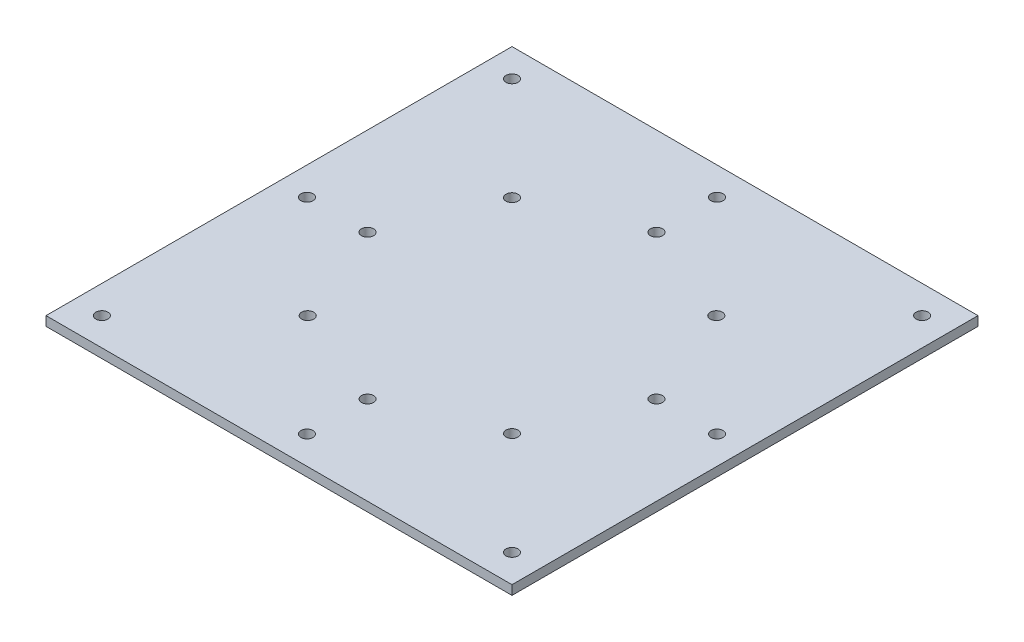
ISO-10303-21;
HEADER;
FILE_DESCRIPTION(('STEP AP214'),'2;1');
FILE_NAME('part.step','',(''),(''),'','','');
FILE_SCHEMA(('AUTOMOTIVE_DESIGN { 1 0 10303 214 1 1 1 1 }'));
ENDSEC;
DATA;
#1=APPLICATION_CONTEXT('core data for automotive mechanical design processes');
#2=APPLICATION_PROTOCOL_DEFINITION('international standard','automotive_design',2000,#1);
#3=PRODUCT_CONTEXT('',#1,'mechanical');
#4=PRODUCT('Part','Part','',(#3));
#5=PRODUCT_RELATED_PRODUCT_CATEGORY('part','',(#4));
#6=PRODUCT_DEFINITION_FORMATION('','',#4);
#7=PRODUCT_DEFINITION_CONTEXT('part definition',#1,'design');
#8=PRODUCT_DEFINITION('design','',#6,#7);
#9=PRODUCT_DEFINITION_SHAPE('','',#8);
#10=(LENGTH_UNIT() NAMED_UNIT(*) SI_UNIT(.MILLI.,.METRE.));
#11=(NAMED_UNIT(*) PLANE_ANGLE_UNIT() SI_UNIT($,.RADIAN.));
#12=(NAMED_UNIT(*) SI_UNIT($,.STERADIAN.) SOLID_ANGLE_UNIT());
#13=UNCERTAINTY_MEASURE_WITH_UNIT(LENGTH_MEASURE(1.E-05),#10,'distance_accuracy_value','');
#14=(GEOMETRIC_REPRESENTATION_CONTEXT(3) GLOBAL_UNCERTAINTY_ASSIGNED_CONTEXT((#13)) GLOBAL_UNIT_ASSIGNED_CONTEXT((#10,
#11,#12)) REPRESENTATION_CONTEXT('',''));
#15=CARTESIAN_POINT('',(0.,0.,0.));
#16=DIRECTION('',(0.,0.,1.));
#17=DIRECTION('',(1.,0.,0.));
#18=AXIS2_PLACEMENT_3D('',#15,#16,#17);
#19=CARTESIAN_POINT('',(0.,5.,0.));
#20=DIRECTION('',(0.,-1.,0.));
#21=DIRECTION('',(0.,0.,-1.));
#22=AXIS2_PLACEMENT_3D('',#19,#20,#21);
#23=PLANE('',#22);
#24=DIRECTION('',(0.,0.,-1.));
#25=VECTOR('',#24,1.);
#26=CARTESIAN_POINT('',(125.,5.,125.));
#27=LINE('',#26,#25);
#28=CARTESIAN_POINT('',(125.,5.,125.));
#29=VERTEX_POINT('',#28);
#30=CARTESIAN_POINT('',(125.,5.,-125.));
#31=VERTEX_POINT('',#30);
#32=EDGE_CURVE('E85',#29,#31,#27,.T.);
#33=ORIENTED_EDGE('',*,*,#32,.T.);
#34=DIRECTION('',(-1.,0.,0.));
#35=VECTOR('',#34,1.);
#36=CARTESIAN_POINT('',(-125.,5.,-125.));
#37=LINE('',#36,#35);
#38=CARTESIAN_POINT('',(-125.,5.,-125.));
#39=VERTEX_POINT('',#38);
#40=EDGE_CURVE('E80',#31,#39,#37,.T.);
#41=ORIENTED_EDGE('',*,*,#40,.T.);
#42=DIRECTION('',(0.,0.,1.));
#43=VECTOR('',#42,1.);
#44=CARTESIAN_POINT('',(-125.,5.,125.));
#45=LINE('',#44,#43);
#46=CARTESIAN_POINT('',(-125.,5.,125.));
#47=VERTEX_POINT('',#46);
#48=EDGE_CURVE('E83',#39,#47,#45,.T.);
#49=ORIENTED_EDGE('',*,*,#48,.T.);
#50=DIRECTION('',(1.,0.,0.));
#51=VECTOR('',#50,1.);
#52=CARTESIAN_POINT('',(-125.,5.,125.));
#53=LINE('',#52,#51);
#54=EDGE_CURVE('E50',#47,#29,#53,.T.);
#55=ORIENTED_EDGE('',*,*,#54,.T.);
#56=EDGE_LOOP('',(#33,#41,#49,#55));
#57=FACE_BOUND('',#56,.T.);
#58=CARTESIAN_POINT('',(-110.,5.,-110.));
#59=DIRECTION('',(0.,1.,0.));
#60=DIRECTION('',(0.,0.,1.));
#61=AXIS2_PLACEMENT_3D('',#58,#59,#60);
#62=CIRCLE('',#61,3.25000000000001);
#63=CARTESIAN_POINT('',(-110.,5.,-106.75));
#64=VERTEX_POINT('',#63);
#65=EDGE_CURVE('E100',#64,#64,#62,.T.);
#66=ORIENTED_EDGE('',*,*,#65,.F.);
#67=EDGE_LOOP('',(#66));
#68=FACE_BOUND('',#67,.T.);
#69=CARTESIAN_POINT('',(-54.8007755419574,5.,-54.8007755419574));
#70=DIRECTION('',(0.,1.,0.));
#71=DIRECTION('',(0.,0.,1.));
#72=AXIS2_PLACEMENT_3D('',#69,#70,#71);
#73=CIRCLE('',#72,3.25);
#74=CARTESIAN_POINT('',(-54.8007755419574,5.,-51.5507755419574));
#75=VERTEX_POINT('',#74);
#76=EDGE_CURVE('E115',#75,#75,#73,.T.);
#77=ORIENTED_EDGE('',*,*,#76,.F.);
#78=EDGE_LOOP('',(#77));
#79=FACE_BOUND('',#78,.T.);
#80=CARTESIAN_POINT('',(0.,5.,-110.));
#81=DIRECTION('',(0.,1.,0.));
#82=DIRECTION('',(0.,0.,1.));
#83=AXIS2_PLACEMENT_3D('',#80,#81,#82);
#84=CIRCLE('',#83,3.25000000000001);
#85=CARTESIAN_POINT('',(0.,5.,-106.75));
#86=VERTEX_POINT('',#85);
#87=EDGE_CURVE('E121',#86,#86,#84,.T.);
#88=ORIENTED_EDGE('',*,*,#87,.F.);
#89=EDGE_LOOP('',(#88));
#90=FACE_BOUND('',#89,.T.);
#91=CARTESIAN_POINT('',(110.,5.,-110.));
#92=DIRECTION('',(0.,1.,0.));
#93=DIRECTION('',(0.,0.,1.));
#94=AXIS2_PLACEMENT_3D('',#91,#92,#93);
#95=CIRCLE('',#94,3.25000000000001);
#96=CARTESIAN_POINT('',(110.,5.,-106.75));
#97=VERTEX_POINT('',#96);
#98=EDGE_CURVE('E127',#97,#97,#95,.T.);
#99=ORIENTED_EDGE('',*,*,#98,.F.);
#100=EDGE_LOOP('',(#99));
#101=FACE_BOUND('',#100,.T.);
#102=CARTESIAN_POINT('',(110.000000000001,5.,0.));
#103=DIRECTION('',(0.,1.,0.));
#104=DIRECTION('',(0.,0.,1.));
#105=AXIS2_PLACEMENT_3D('',#102,#103,#104);
#106=CIRCLE('',#105,3.25000000000001);
#107=CARTESIAN_POINT('',(110.000000000001,5.,3.24999999999998));
#108=VERTEX_POINT('',#107);
#109=EDGE_CURVE('E133',#108,#108,#106,.T.);
#110=ORIENTED_EDGE('',*,*,#109,.F.);
#111=EDGE_LOOP('',(#110));
#112=FACE_BOUND('',#111,.T.);
#113=CARTESIAN_POINT('',(2.24820162486594E-12,5.,110.));
#114=DIRECTION('',(0.,1.,0.));
#115=DIRECTION('',(0.,0.,1.));
#116=AXIS2_PLACEMENT_3D('',#113,#114,#115);
#117=CIRCLE('',#116,3.25000000000001);
#118=CARTESIAN_POINT('',(2.24820162486594E-12,5.,113.25));
#119=VERTEX_POINT('',#118);
#120=EDGE_CURVE('E139',#119,#119,#117,.T.);
#121=ORIENTED_EDGE('',*,*,#120,.F.);
#122=EDGE_LOOP('',(#121));
#123=FACE_BOUND('',#122,.T.);
#124=CARTESIAN_POINT('',(110.000000000002,5.,110.));
#125=DIRECTION('',(0.,1.,0.));
#126=DIRECTION('',(0.,0.,1.));
#127=AXIS2_PLACEMENT_3D('',#124,#125,#126);
#128=CIRCLE('',#127,3.25000000000001);
#129=CARTESIAN_POINT('',(110.000000000002,5.,113.25));
#130=VERTEX_POINT('',#129);
#131=EDGE_CURVE('E145',#130,#130,#128,.T.);
#132=ORIENTED_EDGE('',*,*,#131,.F.);
#133=EDGE_LOOP('',(#132));
#134=FACE_BOUND('',#133,.T.);
#135=CARTESIAN_POINT('',(-109.999999999999,5.,0.));
#136=DIRECTION('',(0.,1.,0.));
#137=DIRECTION('',(0.,0.,1.));
#138=AXIS2_PLACEMENT_3D('',#135,#136,#137);
#139=CIRCLE('',#138,3.25000000000001);
#140=CARTESIAN_POINT('',(-109.999999999999,5.,3.24999999999998));
#141=VERTEX_POINT('',#140);
#142=EDGE_CURVE('E151',#141,#141,#139,.T.);
#143=ORIENTED_EDGE('',*,*,#142,.F.);
#144=EDGE_LOOP('',(#143));
#145=FACE_BOUND('',#144,.T.);
#146=CARTESIAN_POINT('',(-109.999999999998,5.,110.));
#147=DIRECTION('',(0.,1.,0.));
#148=DIRECTION('',(0.,0.,1.));
#149=AXIS2_PLACEMENT_3D('',#146,#147,#148);
#150=CIRCLE('',#149,3.25000000000001);
#151=CARTESIAN_POINT('',(-109.999999999998,5.,113.25));
#152=VERTEX_POINT('',#151);
#153=EDGE_CURVE('E157',#152,#152,#150,.T.);
#154=ORIENTED_EDGE('',*,*,#153,.F.);
#155=EDGE_LOOP('',(#154));
#156=FACE_BOUND('',#155,.T.);
#157=CARTESIAN_POINT('',(1.38777878078145E-13,5.,-77.5));
#158=DIRECTION('',(0.,1.,0.));
#159=DIRECTION('',(0.,0.,1.));
#160=AXIS2_PLACEMENT_3D('',#157,#158,#159);
#161=CIRCLE('',#160,3.25);
#162=CARTESIAN_POINT('',(1.38777878078145E-13,5.,-74.25));
#163=VERTEX_POINT('',#162);
#164=EDGE_CURVE('E163',#163,#163,#161,.T.);
#165=ORIENTED_EDGE('',*,*,#164,.F.);
#166=EDGE_LOOP('',(#165));
#167=FACE_BOUND('',#166,.T.);
#168=CARTESIAN_POINT('',(54.8007755419574,5.,-54.8007755419605));
#169=DIRECTION('',(0.,1.,0.));
#170=DIRECTION('',(0.,0.,1.));
#171=AXIS2_PLACEMENT_3D('',#168,#169,#170);
#172=CIRCLE('',#171,3.25);
#173=CARTESIAN_POINT('',(54.8007755419574,5.,-51.5507755419605));
#174=VERTEX_POINT('',#173);
#175=EDGE_CURVE('E169',#174,#174,#172,.T.);
#176=ORIENTED_EDGE('',*,*,#175,.F.);
#177=EDGE_LOOP('',(#176));
#178=FACE_BOUND('',#177,.T.);
#179=CARTESIAN_POINT('',(77.5000000000015,5.,-3.76716129343266E-12));
#180=DIRECTION('',(0.,1.,0.));
#181=DIRECTION('',(0.,0.,1.));
#182=AXIS2_PLACEMENT_3D('',#179,#180,#181);
#183=CIRCLE('',#182,3.25000000000001);
#184=CARTESIAN_POINT('',(77.5000000000015,5.,3.24999999999624));
#185=VERTEX_POINT('',#184);
#186=EDGE_CURVE('E175',#185,#185,#183,.T.);
#187=ORIENTED_EDGE('',*,*,#186,.F.);
#188=EDGE_LOOP('',(#187));
#189=FACE_BOUND('',#188,.T.);
#190=CARTESIAN_POINT('',(54.8007755419605,5.,54.8007755419543));
#191=DIRECTION('',(0.,1.,0.));
#192=DIRECTION('',(0.,0.,1.));
#193=AXIS2_PLACEMENT_3D('',#190,#191,#192);
#194=CIRCLE('',#193,3.25);
#195=CARTESIAN_POINT('',(54.8007755419605,5.,58.0507755419543));
#196=VERTEX_POINT('',#195);
#197=EDGE_CURVE('E181',#196,#196,#194,.T.);
#198=ORIENTED_EDGE('',*,*,#197,.F.);
#199=EDGE_LOOP('',(#198));
#200=FACE_BOUND('',#199,.T.);
#201=CARTESIAN_POINT('',(3.76716129343266E-12,5.,77.4999999999985));
#202=DIRECTION('',(0.,1.,0.));
#203=DIRECTION('',(0.,0.,1.));
#204=AXIS2_PLACEMENT_3D('',#201,#202,#203);
#205=CIRCLE('',#204,3.25);
#206=CARTESIAN_POINT('',(3.76716129343266E-12,5.,80.7499999999985));
#207=VERTEX_POINT('',#206);
#208=EDGE_CURVE('E187',#207,#207,#205,.T.);
#209=ORIENTED_EDGE('',*,*,#208,.F.);
#210=EDGE_LOOP('',(#209));
#211=FACE_BOUND('',#210,.T.);
#212=CARTESIAN_POINT('',(-54.8007755419543,5.,54.8007755419574));
#213=DIRECTION('',(0.,1.,0.));
#214=DIRECTION('',(0.,0.,1.));
#215=AXIS2_PLACEMENT_3D('',#212,#213,#214);
#216=CIRCLE('',#215,3.25);
#217=CARTESIAN_POINT('',(-54.8007755419543,5.,58.0507755419574));
#218=VERTEX_POINT('',#217);
#219=EDGE_CURVE('E193',#218,#218,#216,.T.);
#220=ORIENTED_EDGE('',*,*,#219,.F.);
#221=EDGE_LOOP('',(#220));
#222=FACE_BOUND('',#221,.T.);
#223=CARTESIAN_POINT('',(-77.5,5.,-9.43689570931383E-13));
#224=DIRECTION('',(0.,1.,0.));
#225=DIRECTION('',(0.,0.,1.));
#226=AXIS2_PLACEMENT_3D('',#223,#224,#225);
#227=CIRCLE('',#226,3.25000000000001);
#228=CARTESIAN_POINT('',(-77.5,5.,3.24999999999906));
#229=VERTEX_POINT('',#228);
#230=EDGE_CURVE('E199',#229,#229,#227,.T.);
#231=ORIENTED_EDGE('',*,*,#230,.F.);
#232=EDGE_LOOP('',(#231));
#233=FACE_BOUND('',#232,.T.);
#234=ADVANCED_FACE('F33',(#57,#68,#79,#90,#101,#112,#123,#134,#145,#156,#167,#178,#189,#200,
#211,#222,#233),#23,.F.);
#235=CARTESIAN_POINT('',(0.,0.,0.));
#236=DIRECTION('',(0.,-1.,0.));
#237=DIRECTION('',(0.,0.,-1.));
#238=AXIS2_PLACEMENT_3D('',#235,#236,#237);
#239=PLANE('',#238);
#240=CARTESIAN_POINT('',(-54.8007755419543,0.,54.8007755419574));
#241=DIRECTION('',(0.,1.,0.));
#242=DIRECTION('',(0.,0.,1.));
#243=AXIS2_PLACEMENT_3D('',#240,#241,#242);
#244=CIRCLE('',#243,3.25);
#245=CARTESIAN_POINT('',(-54.8007755419543,0.,58.0507755419574));
#246=VERTEX_POINT('',#245);
#247=EDGE_CURVE('E196',#246,#246,#244,.T.);
#248=ORIENTED_EDGE('',*,*,#247,.T.);
#249=EDGE_LOOP('',(#248));
#250=FACE_BOUND('',#249,.T.);
#251=CARTESIAN_POINT('',(54.8007755419605,0.,54.8007755419543));
#252=DIRECTION('',(0.,1.,0.));
#253=DIRECTION('',(0.,0.,1.));
#254=AXIS2_PLACEMENT_3D('',#251,#252,#253);
#255=CIRCLE('',#254,3.25);
#256=CARTESIAN_POINT('',(54.8007755419605,0.,58.0507755419543));
#257=VERTEX_POINT('',#256);
#258=EDGE_CURVE('E184',#257,#257,#255,.T.);
#259=ORIENTED_EDGE('',*,*,#258,.T.);
#260=EDGE_LOOP('',(#259));
#261=FACE_BOUND('',#260,.T.);
#262=CARTESIAN_POINT('',(54.8007755419574,0.,-54.8007755419605));
#263=DIRECTION('',(0.,1.,0.));
#264=DIRECTION('',(0.,0.,1.));
#265=AXIS2_PLACEMENT_3D('',#262,#263,#264);
#266=CIRCLE('',#265,3.25);
#267=CARTESIAN_POINT('',(54.8007755419574,0.,-51.5507755419605));
#268=VERTEX_POINT('',#267);
#269=EDGE_CURVE('E172',#268,#268,#266,.T.);
#270=ORIENTED_EDGE('',*,*,#269,.T.);
#271=EDGE_LOOP('',(#270));
#272=FACE_BOUND('',#271,.T.);
#273=CARTESIAN_POINT('',(-109.999999999998,0.,110.));
#274=DIRECTION('',(0.,1.,0.));
#275=DIRECTION('',(0.,0.,1.));
#276=AXIS2_PLACEMENT_3D('',#273,#274,#275);
#277=CIRCLE('',#276,3.25000000000001);
#278=CARTESIAN_POINT('',(-109.999999999998,0.,113.25));
#279=VERTEX_POINT('',#278);
#280=EDGE_CURVE('E160',#279,#279,#277,.T.);
#281=ORIENTED_EDGE('',*,*,#280,.T.);
#282=EDGE_LOOP('',(#281));
#283=FACE_BOUND('',#282,.T.);
#284=CARTESIAN_POINT('',(110.000000000002,0.,110.));
#285=DIRECTION('',(0.,1.,0.));
#286=DIRECTION('',(0.,0.,1.));
#287=AXIS2_PLACEMENT_3D('',#284,#285,#286);
#288=CIRCLE('',#287,3.25000000000001);
#289=CARTESIAN_POINT('',(110.000000000002,0.,113.25));
#290=VERTEX_POINT('',#289);
#291=EDGE_CURVE('E148',#290,#290,#288,.T.);
#292=ORIENTED_EDGE('',*,*,#291,.T.);
#293=EDGE_LOOP('',(#292));
#294=FACE_BOUND('',#293,.T.);
#295=CARTESIAN_POINT('',(110.000000000001,0.,0.));
#296=DIRECTION('',(0.,1.,0.));
#297=DIRECTION('',(0.,0.,1.));
#298=AXIS2_PLACEMENT_3D('',#295,#296,#297);
#299=CIRCLE('',#298,3.25000000000001);
#300=CARTESIAN_POINT('',(110.000000000001,0.,3.24999999999998));
#301=VERTEX_POINT('',#300);
#302=EDGE_CURVE('E136',#301,#301,#299,.T.);
#303=ORIENTED_EDGE('',*,*,#302,.T.);
#304=EDGE_LOOP('',(#303));
#305=FACE_BOUND('',#304,.T.);
#306=CARTESIAN_POINT('',(0.,0.,-110.));
#307=DIRECTION('',(0.,1.,0.));
#308=DIRECTION('',(0.,0.,1.));
#309=AXIS2_PLACEMENT_3D('',#306,#307,#308);
#310=CIRCLE('',#309,3.25000000000001);
#311=CARTESIAN_POINT('',(0.,0.,-106.75));
#312=VERTEX_POINT('',#311);
#313=EDGE_CURVE('E124',#312,#312,#310,.T.);
#314=ORIENTED_EDGE('',*,*,#313,.T.);
#315=EDGE_LOOP('',(#314));
#316=FACE_BOUND('',#315,.T.);
#317=CARTESIAN_POINT('',(-110.,0.,-110.));
#318=DIRECTION('',(0.,1.,0.));
#319=DIRECTION('',(0.,0.,1.));
#320=AXIS2_PLACEMENT_3D('',#317,#318,#319);
#321=CIRCLE('',#320,3.25000000000001);
#322=CARTESIAN_POINT('',(-110.,0.,-106.75));
#323=VERTEX_POINT('',#322);
#324=EDGE_CURVE('E112',#323,#323,#321,.T.);
#325=ORIENTED_EDGE('',*,*,#324,.T.);
#326=EDGE_LOOP('',(#325));
#327=FACE_BOUND('',#326,.T.);
#328=DIRECTION('',(0.,0.,-1.));
#329=VECTOR('',#328,1.);
#330=CARTESIAN_POINT('',(125.,0.,125.));
#331=LINE('',#330,#329);
#332=CARTESIAN_POINT('',(125.,0.,125.));
#333=VERTEX_POINT('',#332);
#334=CARTESIAN_POINT('',(125.,0.,-125.));
#335=VERTEX_POINT('',#334);
#336=EDGE_CURVE('E97',#333,#335,#331,.T.);
#337=ORIENTED_EDGE('',*,*,#336,.F.);
#338=DIRECTION('',(1.,0.,0.));
#339=VECTOR('',#338,1.);
#340=CARTESIAN_POINT('',(-125.,0.,125.));
#341=LINE('',#340,#339);
#342=CARTESIAN_POINT('',(-125.,0.,125.));
#343=VERTEX_POINT('',#342);
#344=EDGE_CURVE('E73',#343,#333,#341,.T.);
#345=ORIENTED_EDGE('',*,*,#344,.F.);
#346=DIRECTION('',(0.,0.,1.));
#347=VECTOR('',#346,1.);
#348=CARTESIAN_POINT('',(-125.,0.,125.));
#349=LINE('',#348,#347);
#350=CARTESIAN_POINT('',(-125.,0.,-125.));
#351=VERTEX_POINT('',#350);
#352=EDGE_CURVE('E67',#351,#343,#349,.T.);
#353=ORIENTED_EDGE('',*,*,#352,.F.);
#354=DIRECTION('',(-1.,0.,0.));
#355=VECTOR('',#354,1.);
#356=CARTESIAN_POINT('',(-125.,0.,-125.));
#357=LINE('',#356,#355);
#358=EDGE_CURVE('E89',#335,#351,#357,.T.);
#359=ORIENTED_EDGE('',*,*,#358,.F.);
#360=EDGE_LOOP('',(#337,#345,#353,#359));
#361=FACE_BOUND('',#360,.T.);
#362=CARTESIAN_POINT('',(-54.8007755419574,0.,-54.8007755419574));
#363=DIRECTION('',(0.,1.,0.));
#364=DIRECTION('',(0.,0.,1.));
#365=AXIS2_PLACEMENT_3D('',#362,#363,#364);
#366=CIRCLE('',#365,3.25);
#367=CARTESIAN_POINT('',(-54.8007755419574,0.,-51.5507755419574));
#368=VERTEX_POINT('',#367);
#369=EDGE_CURVE('E118',#368,#368,#366,.T.);
#370=ORIENTED_EDGE('',*,*,#369,.T.);
#371=EDGE_LOOP('',(#370));
#372=FACE_BOUND('',#371,.T.);
#373=CARTESIAN_POINT('',(110.,0.,-110.));
#374=DIRECTION('',(0.,1.,0.));
#375=DIRECTION('',(0.,0.,1.));
#376=AXIS2_PLACEMENT_3D('',#373,#374,#375);
#377=CIRCLE('',#376,3.25000000000001);
#378=CARTESIAN_POINT('',(110.,0.,-106.75));
#379=VERTEX_POINT('',#378);
#380=EDGE_CURVE('E130',#379,#379,#377,.T.);
#381=ORIENTED_EDGE('',*,*,#380,.T.);
#382=EDGE_LOOP('',(#381));
#383=FACE_BOUND('',#382,.T.);
#384=CARTESIAN_POINT('',(2.24820162486594E-12,0.,110.));
#385=DIRECTION('',(0.,1.,0.));
#386=DIRECTION('',(0.,0.,1.));
#387=AXIS2_PLACEMENT_3D('',#384,#385,#386);
#388=CIRCLE('',#387,3.25000000000001);
#389=CARTESIAN_POINT('',(2.24820162486594E-12,0.,113.25));
#390=VERTEX_POINT('',#389);
#391=EDGE_CURVE('E142',#390,#390,#388,.T.);
#392=ORIENTED_EDGE('',*,*,#391,.T.);
#393=EDGE_LOOP('',(#392));
#394=FACE_BOUND('',#393,.T.);
#395=CARTESIAN_POINT('',(-109.999999999999,0.,0.));
#396=DIRECTION('',(0.,1.,0.));
#397=DIRECTION('',(0.,0.,1.));
#398=AXIS2_PLACEMENT_3D('',#395,#396,#397);
#399=CIRCLE('',#398,3.25000000000001);
#400=CARTESIAN_POINT('',(-109.999999999999,0.,3.24999999999998));
#401=VERTEX_POINT('',#400);
#402=EDGE_CURVE('E154',#401,#401,#399,.T.);
#403=ORIENTED_EDGE('',*,*,#402,.T.);
#404=EDGE_LOOP('',(#403));
#405=FACE_BOUND('',#404,.T.);
#406=CARTESIAN_POINT('',(1.38777878078145E-13,0.,-77.5));
#407=DIRECTION('',(0.,1.,0.));
#408=DIRECTION('',(0.,0.,1.));
#409=AXIS2_PLACEMENT_3D('',#406,#407,#408);
#410=CIRCLE('',#409,3.25);
#411=CARTESIAN_POINT('',(1.38777878078145E-13,0.,-74.25));
#412=VERTEX_POINT('',#411);
#413=EDGE_CURVE('E166',#412,#412,#410,.T.);
#414=ORIENTED_EDGE('',*,*,#413,.T.);
#415=EDGE_LOOP('',(#414));
#416=FACE_BOUND('',#415,.T.);
#417=CARTESIAN_POINT('',(77.5000000000015,0.,-3.76716129343266E-12));
#418=DIRECTION('',(0.,1.,0.));
#419=DIRECTION('',(0.,0.,1.));
#420=AXIS2_PLACEMENT_3D('',#417,#418,#419);
#421=CIRCLE('',#420,3.25000000000001);
#422=CARTESIAN_POINT('',(77.5000000000015,0.,3.24999999999624));
#423=VERTEX_POINT('',#422);
#424=EDGE_CURVE('E178',#423,#423,#421,.T.);
#425=ORIENTED_EDGE('',*,*,#424,.T.);
#426=EDGE_LOOP('',(#425));
#427=FACE_BOUND('',#426,.T.);
#428=CARTESIAN_POINT('',(3.76716129343266E-12,0.,77.4999999999985));
#429=DIRECTION('',(0.,1.,0.));
#430=DIRECTION('',(0.,0.,1.));
#431=AXIS2_PLACEMENT_3D('',#428,#429,#430);
#432=CIRCLE('',#431,3.25);
#433=CARTESIAN_POINT('',(3.76716129343266E-12,0.,80.7499999999985));
#434=VERTEX_POINT('',#433);
#435=EDGE_CURVE('E190',#434,#434,#432,.T.);
#436=ORIENTED_EDGE('',*,*,#435,.T.);
#437=EDGE_LOOP('',(#436));
#438=FACE_BOUND('',#437,.T.);
#439=CARTESIAN_POINT('',(-77.5,0.,-9.43689570931383E-13));
#440=DIRECTION('',(0.,1.,0.));
#441=DIRECTION('',(0.,0.,1.));
#442=AXIS2_PLACEMENT_3D('',#439,#440,#441);
#443=CIRCLE('',#442,3.25000000000001);
#444=CARTESIAN_POINT('',(-77.5,0.,3.24999999999906));
#445=VERTEX_POINT('',#444);
#446=EDGE_CURVE('E202',#445,#445,#443,.T.);
#447=ORIENTED_EDGE('',*,*,#446,.T.);
#448=EDGE_LOOP('',(#447));
#449=FACE_BOUND('',#448,.T.);
#450=ADVANCED_FACE('F108',(#250,#261,#272,#283,#294,#305,#316,#327,#361,#372,#383,#394,#405,
#416,#427,#438,#449),#239,.T.);
#451=CARTESIAN_POINT('',(125.,5.,125.));
#452=DIRECTION('',(-1.,0.,0.));
#453=DIRECTION('',(0.,0.,1.));
#454=AXIS2_PLACEMENT_3D('',#451,#452,#453);
#455=PLANE('',#454);
#456=ORIENTED_EDGE('',*,*,#336,.T.);
#457=DIRECTION('',(0.,-1.,0.));
#458=VECTOR('',#457,1.);
#459=CARTESIAN_POINT('',(125.,5.,-125.));
#460=LINE('',#459,#458);
#461=EDGE_CURVE('E11',#31,#335,#460,.T.);
#462=ORIENTED_EDGE('',*,*,#461,.F.);
#463=ORIENTED_EDGE('',*,*,#32,.F.);
#464=DIRECTION('',(0.,-1.,0.));
#465=VECTOR('',#464,1.);
#466=CARTESIAN_POINT('',(125.,5.,125.));
#467=LINE('',#466,#465);
#468=EDGE_CURVE('E93',#29,#333,#467,.T.);
#469=ORIENTED_EDGE('',*,*,#468,.T.);
#470=EDGE_LOOP('',(#456,#462,#463,#469));
#471=FACE_BOUND('',#470,.T.);
#472=ADVANCED_FACE('F35',(#471),#455,.F.);
#473=CARTESIAN_POINT('',(-125.,5.,-125.));
#474=DIRECTION('',(0.,0.,1.));
#475=DIRECTION('',(1.,0.,0.));
#476=AXIS2_PLACEMENT_3D('',#473,#474,#475);
#477=PLANE('',#476);
#478=ORIENTED_EDGE('',*,*,#358,.T.);
#479=DIRECTION('',(0.,-1.,0.));
#480=VECTOR('',#479,1.);
#481=CARTESIAN_POINT('',(-125.,5.,-125.));
#482=LINE('',#481,#480);
#483=EDGE_CURVE('E42',#39,#351,#482,.T.);
#484=ORIENTED_EDGE('',*,*,#483,.F.);
#485=ORIENTED_EDGE('',*,*,#40,.F.);
#486=ORIENTED_EDGE('',*,*,#461,.T.);
#487=EDGE_LOOP('',(#478,#484,#485,#486));
#488=FACE_BOUND('',#487,.T.);
#489=ADVANCED_FACE('F88',(#488),#477,.F.);
#490=CARTESIAN_POINT('',(-125.,5.,125.));
#491=DIRECTION('',(1.,0.,0.));
#492=DIRECTION('',(0.,0.,-1.));
#493=AXIS2_PLACEMENT_3D('',#490,#491,#492);
#494=PLANE('',#493);
#495=ORIENTED_EDGE('',*,*,#352,.T.);
#496=DIRECTION('',(0.,-1.,0.));
#497=VECTOR('',#496,1.);
#498=CARTESIAN_POINT('',(-125.,5.,125.));
#499=LINE('',#498,#497);
#500=EDGE_CURVE('E90',#47,#343,#499,.T.);
#501=ORIENTED_EDGE('',*,*,#500,.F.);
#502=ORIENTED_EDGE('',*,*,#48,.F.);
#503=ORIENTED_EDGE('',*,*,#483,.T.);
#504=EDGE_LOOP('',(#495,#501,#502,#503));
#505=FACE_BOUND('',#504,.T.);
#506=ADVANCED_FACE('F91',(#505),#494,.F.);
#507=CARTESIAN_POINT('',(-125.,5.,125.));
#508=DIRECTION('',(0.,0.,-1.));
#509=DIRECTION('',(-1.,0.,0.));
#510=AXIS2_PLACEMENT_3D('',#507,#508,#509);
#511=PLANE('',#510);
#512=ORIENTED_EDGE('',*,*,#344,.T.);
#513=ORIENTED_EDGE('',*,*,#468,.F.);
#514=ORIENTED_EDGE('',*,*,#54,.F.);
#515=ORIENTED_EDGE('',*,*,#500,.T.);
#516=EDGE_LOOP('',(#512,#513,#514,#515));
#517=FACE_BOUND('',#516,.T.);
#518=ADVANCED_FACE('F105',(#517),#511,.F.);
#519=CARTESIAN_POINT('',(-110.,5.,-110.));
#520=DIRECTION('',(0.,-1.,0.));
#521=DIRECTION('',(0.,0.,-1.));
#522=AXIS2_PLACEMENT_3D('',#519,#520,#521);
#523=CYLINDRICAL_SURFACE('',#522,3.25000000000001);
#524=ORIENTED_EDGE('',*,*,#65,.T.);
#525=EDGE_LOOP('',(#524));
#526=FACE_BOUND('',#525,.T.);
#527=ORIENTED_EDGE('',*,*,#324,.F.);
#528=EDGE_LOOP('',(#527));
#529=FACE_BOUND('',#528,.T.);
#530=ADVANCED_FACE('F219',(#526,#529),#523,.F.);
#531=CARTESIAN_POINT('',(-54.8007755419574,5.,-54.8007755419574));
#532=DIRECTION('',(0.,-1.,0.));
#533=DIRECTION('',(0.,0.,-1.));
#534=AXIS2_PLACEMENT_3D('',#531,#532,#533);
#535=CYLINDRICAL_SURFACE('',#534,3.25);
#536=ORIENTED_EDGE('',*,*,#76,.T.);
#537=EDGE_LOOP('',(#536));
#538=FACE_BOUND('',#537,.T.);
#539=ORIENTED_EDGE('',*,*,#369,.F.);
#540=EDGE_LOOP('',(#539));
#541=FACE_BOUND('',#540,.T.);
#542=ADVANCED_FACE('F265',(#538,#541),#535,.F.);
#543=CARTESIAN_POINT('',(0.,5.,-110.));
#544=DIRECTION('',(0.,-1.,0.));
#545=DIRECTION('',(0.,0.,-1.));
#546=AXIS2_PLACEMENT_3D('',#543,#544,#545);
#547=CYLINDRICAL_SURFACE('',#546,3.25000000000001);
#548=ORIENTED_EDGE('',*,*,#87,.T.);
#549=EDGE_LOOP('',(#548));
#550=FACE_BOUND('',#549,.T.);
#551=ORIENTED_EDGE('',*,*,#313,.F.);
#552=EDGE_LOOP('',(#551));
#553=FACE_BOUND('',#552,.T.);
#554=ADVANCED_FACE('F273',(#550,#553),#547,.F.);
#555=CARTESIAN_POINT('',(110.,5.,-110.));
#556=DIRECTION('',(0.,-1.,0.));
#557=DIRECTION('',(0.,0.,-1.));
#558=AXIS2_PLACEMENT_3D('',#555,#556,#557);
#559=CYLINDRICAL_SURFACE('',#558,3.25000000000001);
#560=ORIENTED_EDGE('',*,*,#98,.T.);
#561=EDGE_LOOP('',(#560));
#562=FACE_BOUND('',#561,.T.);
#563=ORIENTED_EDGE('',*,*,#380,.F.);
#564=EDGE_LOOP('',(#563));
#565=FACE_BOUND('',#564,.T.);
#566=ADVANCED_FACE('F281',(#562,#565),#559,.F.);
#567=CARTESIAN_POINT('',(110.000000000001,5.,0.));
#568=DIRECTION('',(0.,-1.,0.));
#569=DIRECTION('',(0.,0.,-1.));
#570=AXIS2_PLACEMENT_3D('',#567,#568,#569);
#571=CYLINDRICAL_SURFACE('',#570,3.25000000000001);
#572=ORIENTED_EDGE('',*,*,#109,.T.);
#573=EDGE_LOOP('',(#572));
#574=FACE_BOUND('',#573,.T.);
#575=ORIENTED_EDGE('',*,*,#302,.F.);
#576=EDGE_LOOP('',(#575));
#577=FACE_BOUND('',#576,.T.);
#578=ADVANCED_FACE('F290',(#574,#577),#571,.F.);
#579=CARTESIAN_POINT('',(2.24820162486594E-12,5.,110.));
#580=DIRECTION('',(0.,-1.,0.));
#581=DIRECTION('',(0.,0.,-1.));
#582=AXIS2_PLACEMENT_3D('',#579,#580,#581);
#583=CYLINDRICAL_SURFACE('',#582,3.25000000000001);
#584=ORIENTED_EDGE('',*,*,#120,.T.);
#585=EDGE_LOOP('',(#584));
#586=FACE_BOUND('',#585,.T.);
#587=ORIENTED_EDGE('',*,*,#391,.F.);
#588=EDGE_LOOP('',(#587));
#589=FACE_BOUND('',#588,.T.);
#590=ADVANCED_FACE('F299',(#586,#589),#583,.F.);
#591=CARTESIAN_POINT('',(110.000000000002,5.,110.));
#592=DIRECTION('',(0.,-1.,0.));
#593=DIRECTION('',(0.,0.,-1.));
#594=AXIS2_PLACEMENT_3D('',#591,#592,#593);
#595=CYLINDRICAL_SURFACE('',#594,3.25000000000001);
#596=ORIENTED_EDGE('',*,*,#131,.T.);
#597=EDGE_LOOP('',(#596));
#598=FACE_BOUND('',#597,.T.);
#599=ORIENTED_EDGE('',*,*,#291,.F.);
#600=EDGE_LOOP('',(#599));
#601=FACE_BOUND('',#600,.T.);
#602=ADVANCED_FACE('F308',(#598,#601),#595,.F.);
#603=CARTESIAN_POINT('',(-109.999999999999,5.,0.));
#604=DIRECTION('',(0.,-1.,0.));
#605=DIRECTION('',(0.,0.,-1.));
#606=AXIS2_PLACEMENT_3D('',#603,#604,#605);
#607=CYLINDRICAL_SURFACE('',#606,3.25000000000001);
#608=ORIENTED_EDGE('',*,*,#142,.T.);
#609=EDGE_LOOP('',(#608));
#610=FACE_BOUND('',#609,.T.);
#611=ORIENTED_EDGE('',*,*,#402,.F.);
#612=EDGE_LOOP('',(#611));
#613=FACE_BOUND('',#612,.T.);
#614=ADVANCED_FACE('F317',(#610,#613),#607,.F.);
#615=CARTESIAN_POINT('',(-109.999999999998,5.,110.));
#616=DIRECTION('',(0.,-1.,0.));
#617=DIRECTION('',(0.,0.,-1.));
#618=AXIS2_PLACEMENT_3D('',#615,#616,#617);
#619=CYLINDRICAL_SURFACE('',#618,3.25000000000001);
#620=ORIENTED_EDGE('',*,*,#153,.T.);
#621=EDGE_LOOP('',(#620));
#622=FACE_BOUND('',#621,.T.);
#623=ORIENTED_EDGE('',*,*,#280,.F.);
#624=EDGE_LOOP('',(#623));
#625=FACE_BOUND('',#624,.T.);
#626=ADVANCED_FACE('F326',(#622,#625),#619,.F.);
#627=CARTESIAN_POINT('',(1.38777878078145E-13,5.,-77.5));
#628=DIRECTION('',(0.,-1.,0.));
#629=DIRECTION('',(0.,0.,-1.));
#630=AXIS2_PLACEMENT_3D('',#627,#628,#629);
#631=CYLINDRICAL_SURFACE('',#630,3.25);
#632=ORIENTED_EDGE('',*,*,#164,.T.);
#633=EDGE_LOOP('',(#632));
#634=FACE_BOUND('',#633,.T.);
#635=ORIENTED_EDGE('',*,*,#413,.F.);
#636=EDGE_LOOP('',(#635));
#637=FACE_BOUND('',#636,.T.);
#638=ADVANCED_FACE('F335',(#634,#637),#631,.F.);
#639=CARTESIAN_POINT('',(54.8007755419574,5.,-54.8007755419605));
#640=DIRECTION('',(0.,-1.,0.));
#641=DIRECTION('',(0.,0.,-1.));
#642=AXIS2_PLACEMENT_3D('',#639,#640,#641);
#643=CYLINDRICAL_SURFACE('',#642,3.25);
#644=ORIENTED_EDGE('',*,*,#175,.T.);
#645=EDGE_LOOP('',(#644));
#646=FACE_BOUND('',#645,.T.);
#647=ORIENTED_EDGE('',*,*,#269,.F.);
#648=EDGE_LOOP('',(#647));
#649=FACE_BOUND('',#648,.T.);
#650=ADVANCED_FACE('F344',(#646,#649),#643,.F.);
#651=CARTESIAN_POINT('',(77.5000000000015,5.,-3.76716129343266E-12));
#652=DIRECTION('',(0.,-1.,0.));
#653=DIRECTION('',(0.,0.,-1.));
#654=AXIS2_PLACEMENT_3D('',#651,#652,#653);
#655=CYLINDRICAL_SURFACE('',#654,3.25000000000001);
#656=ORIENTED_EDGE('',*,*,#186,.T.);
#657=EDGE_LOOP('',(#656));
#658=FACE_BOUND('',#657,.T.);
#659=ORIENTED_EDGE('',*,*,#424,.F.);
#660=EDGE_LOOP('',(#659));
#661=FACE_BOUND('',#660,.T.);
#662=ADVANCED_FACE('F353',(#658,#661),#655,.F.);
#663=CARTESIAN_POINT('',(54.8007755419605,5.,54.8007755419543));
#664=DIRECTION('',(0.,-1.,0.));
#665=DIRECTION('',(0.,0.,-1.));
#666=AXIS2_PLACEMENT_3D('',#663,#664,#665);
#667=CYLINDRICAL_SURFACE('',#666,3.25);
#668=ORIENTED_EDGE('',*,*,#197,.T.);
#669=EDGE_LOOP('',(#668));
#670=FACE_BOUND('',#669,.T.);
#671=ORIENTED_EDGE('',*,*,#258,.F.);
#672=EDGE_LOOP('',(#671));
#673=FACE_BOUND('',#672,.T.);
#674=ADVANCED_FACE('F362',(#670,#673),#667,.F.);
#675=CARTESIAN_POINT('',(3.76716129343266E-12,5.,77.4999999999985));
#676=DIRECTION('',(0.,-1.,0.));
#677=DIRECTION('',(0.,0.,-1.));
#678=AXIS2_PLACEMENT_3D('',#675,#676,#677);
#679=CYLINDRICAL_SURFACE('',#678,3.25);
#680=ORIENTED_EDGE('',*,*,#208,.T.);
#681=EDGE_LOOP('',(#680));
#682=FACE_BOUND('',#681,.T.);
#683=ORIENTED_EDGE('',*,*,#435,.F.);
#684=EDGE_LOOP('',(#683));
#685=FACE_BOUND('',#684,.T.);
#686=ADVANCED_FACE('F371',(#682,#685),#679,.F.);
#687=CARTESIAN_POINT('',(-54.8007755419543,5.,54.8007755419574));
#688=DIRECTION('',(0.,-1.,0.));
#689=DIRECTION('',(0.,0.,-1.));
#690=AXIS2_PLACEMENT_3D('',#687,#688,#689);
#691=CYLINDRICAL_SURFACE('',#690,3.25);
#692=ORIENTED_EDGE('',*,*,#219,.T.);
#693=EDGE_LOOP('',(#692));
#694=FACE_BOUND('',#693,.T.);
#695=ORIENTED_EDGE('',*,*,#247,.F.);
#696=EDGE_LOOP('',(#695));
#697=FACE_BOUND('',#696,.T.);
#698=ADVANCED_FACE('F380',(#694,#697),#691,.F.);
#699=CARTESIAN_POINT('',(-77.5,5.,-9.43689570931383E-13));
#700=DIRECTION('',(0.,-1.,0.));
#701=DIRECTION('',(0.,0.,-1.));
#702=AXIS2_PLACEMENT_3D('',#699,#700,#701);
#703=CYLINDRICAL_SURFACE('',#702,3.25000000000001);
#704=ORIENTED_EDGE('',*,*,#230,.T.);
#705=EDGE_LOOP('',(#704));
#706=FACE_BOUND('',#705,.T.);
#707=ORIENTED_EDGE('',*,*,#446,.F.);
#708=EDGE_LOOP('',(#707));
#709=FACE_BOUND('',#708,.T.);
#710=ADVANCED_FACE('F208',(#706,#709),#703,.F.);
#711=CLOSED_SHELL('',(#234,#450,#472,#489,#506,#518,#530,#542,#554,#566,#578,#590,#602,#614,
#626,#638,#650,#662,#674,#686,#698,#710));
#712=MANIFOLD_SOLID_BREP('B2',#711);
#713=ADVANCED_BREP_SHAPE_REPRESENTATION('',(#18,#712),#14);
#714=SHAPE_DEFINITION_REPRESENTATION(#9,#713);
ENDSEC;
END-ISO-10303-21;
